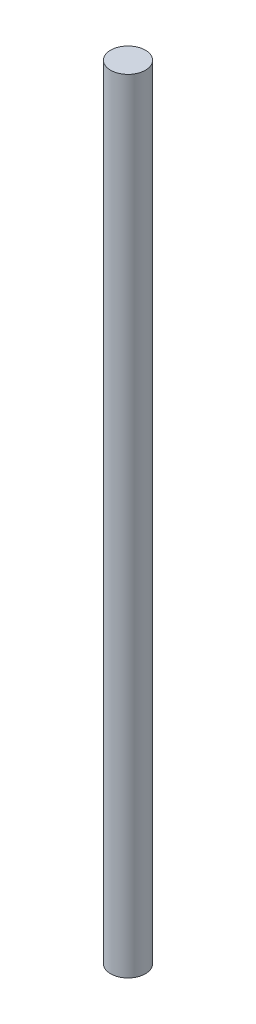
ISO-10303-21;
HEADER;
FILE_DESCRIPTION(('STEP AP214'),'2;1');
FILE_NAME('part.step','',(''),(''),'','','');
FILE_SCHEMA(('AUTOMOTIVE_DESIGN { 1 0 10303 214 1 1 1 1 }'));
ENDSEC;
DATA;
#1=APPLICATION_CONTEXT('core data for automotive mechanical design processes');
#2=APPLICATION_PROTOCOL_DEFINITION('international standard','automotive_design',2000,#1);
#3=PRODUCT_CONTEXT('',#1,'mechanical');
#4=PRODUCT('Part','Part','',(#3));
#5=PRODUCT_RELATED_PRODUCT_CATEGORY('part','',(#4));
#6=PRODUCT_DEFINITION_FORMATION('','',#4);
#7=PRODUCT_DEFINITION_CONTEXT('part definition',#1,'design');
#8=PRODUCT_DEFINITION('design','',#6,#7);
#9=PRODUCT_DEFINITION_SHAPE('','',#8);
#10=(LENGTH_UNIT() NAMED_UNIT(*) SI_UNIT(.MILLI.,.METRE.));
#11=(NAMED_UNIT(*) PLANE_ANGLE_UNIT() SI_UNIT($,.RADIAN.));
#12=(NAMED_UNIT(*) SI_UNIT($,.STERADIAN.) SOLID_ANGLE_UNIT());
#13=UNCERTAINTY_MEASURE_WITH_UNIT(LENGTH_MEASURE(1.E-05),#10,'distance_accuracy_value','');
#14=(GEOMETRIC_REPRESENTATION_CONTEXT(3) GLOBAL_UNCERTAINTY_ASSIGNED_CONTEXT((#13)) GLOBAL_UNIT_ASSIGNED_CONTEXT((#10,
#11,#12)) REPRESENTATION_CONTEXT('',''));
#15=CARTESIAN_POINT('',(0.,0.,0.));
#16=DIRECTION('',(0.,0.,1.));
#17=DIRECTION('',(1.,0.,0.));
#18=AXIS2_PLACEMENT_3D('',#15,#16,#17);
#19=CARTESIAN_POINT('',(0.,45.,0.));
#20=DIRECTION('',(0.,-1.,0.));
#21=DIRECTION('',(0.,0.,-1.));
#22=AXIS2_PLACEMENT_3D('',#19,#20,#21);
#23=CYLINDRICAL_SURFACE('',#22,2.);
#24=CARTESIAN_POINT('',(0.,45.,0.));
#25=DIRECTION('',(0.,1.,0.));
#26=DIRECTION('',(0.,0.,1.));
#27=AXIS2_PLACEMENT_3D('',#24,#25,#26);
#28=CIRCLE('',#27,2.);
#29=CARTESIAN_POINT('',(0.,45.,-2.));
#30=VERTEX_POINT('',#29);
#31=EDGE_CURVE('E10',#30,#30,#28,.T.);
#32=CARTESIAN_POINT('',(0.,-45.,0.));
#33=DIRECTION('',(0.,1.,0.));
#34=DIRECTION('',(0.,0.,1.));
#35=AXIS2_PLACEMENT_3D('',#32,#33,#34);
#36=CIRCLE('',#35,2.);
#37=CARTESIAN_POINT('',(0.,-45.,-2.));
#38=VERTEX_POINT('',#37);
#39=EDGE_CURVE('E40',#38,#38,#36,.T.);
#40=CARTESIAN_POINT('',(0.,45.,-2.));
#41=CARTESIAN_POINT('',(0.,44.0625,-2.));
#42=CARTESIAN_POINT('',(0.,43.125,-2.));
#43=CARTESIAN_POINT('',(0.,41.25,-2.));
#44=CARTESIAN_POINT('',(0.,40.3125,-2.));
#45=CARTESIAN_POINT('',(0.,38.4375,-2.));
#46=CARTESIAN_POINT('',(0.,37.5,-2.));
#47=CARTESIAN_POINT('',(0.,35.625,-2.));
#48=CARTESIAN_POINT('',(0.,34.6875,-2.));
#49=CARTESIAN_POINT('',(0.,32.8125,-2.));
#50=CARTESIAN_POINT('',(0.,31.875,-2.));
#51=CARTESIAN_POINT('',(0.,30.,-2.));
#52=CARTESIAN_POINT('',(0.,29.0625,-2.));
#53=CARTESIAN_POINT('',(0.,27.1875,-2.));
#54=CARTESIAN_POINT('',(0.,26.25,-2.));
#55=CARTESIAN_POINT('',(0.,24.375,-2.));
#56=CARTESIAN_POINT('',(0.,23.4375,-2.));
#57=CARTESIAN_POINT('',(0.,21.5625,-2.));
#58=CARTESIAN_POINT('',(0.,20.625,-2.));
#59=CARTESIAN_POINT('',(0.,18.75,-2.));
#60=CARTESIAN_POINT('',(0.,17.8125,-2.));
#61=CARTESIAN_POINT('',(0.,15.9375,-2.));
#62=CARTESIAN_POINT('',(0.,15.,-2.));
#63=CARTESIAN_POINT('',(0.,13.125,-2.));
#64=CARTESIAN_POINT('',(0.,12.1875,-2.));
#65=CARTESIAN_POINT('',(0.,10.3125,-2.));
#66=CARTESIAN_POINT('',(0.,9.37499999999999,-2.));
#67=CARTESIAN_POINT('',(0.,7.49999999999999,-2.));
#68=CARTESIAN_POINT('',(0.,6.56249999999999,-2.));
#69=CARTESIAN_POINT('',(0.,4.68749999999999,-2.));
#70=CARTESIAN_POINT('',(0.,3.74999999999999,-2.));
#71=CARTESIAN_POINT('',(0.,1.87499999999999,-2.));
#72=CARTESIAN_POINT('',(0.,0.937499999999987,-2.));
#73=CARTESIAN_POINT('',(0.,-0.937500000000015,-2.));
#74=CARTESIAN_POINT('',(0.,-1.87500000000002,-2.));
#75=CARTESIAN_POINT('',(0.,-3.75000000000002,-2.));
#76=CARTESIAN_POINT('',(0.,-4.68750000000002,-2.));
#77=CARTESIAN_POINT('',(0.,-6.56250000000002,-2.));
#78=CARTESIAN_POINT('',(0.,-7.50000000000002,-2.));
#79=CARTESIAN_POINT('',(0.,-9.37500000000002,-2.));
#80=CARTESIAN_POINT('',(0.,-10.3125,-2.));
#81=CARTESIAN_POINT('',(0.,-12.1875,-2.));
#82=CARTESIAN_POINT('',(0.,-13.125,-2.));
#83=CARTESIAN_POINT('',(0.,-15.,-2.));
#84=CARTESIAN_POINT('',(0.,-15.9375,-2.));
#85=CARTESIAN_POINT('',(0.,-17.8125,-2.));
#86=CARTESIAN_POINT('',(0.,-18.75,-2.));
#87=CARTESIAN_POINT('',(0.,-20.625,-2.));
#88=CARTESIAN_POINT('',(0.,-21.5625,-2.));
#89=CARTESIAN_POINT('',(0.,-23.4375,-2.));
#90=CARTESIAN_POINT('',(0.,-24.375,-2.));
#91=CARTESIAN_POINT('',(0.,-26.25,-2.));
#92=CARTESIAN_POINT('',(0.,-27.1875,-2.));
#93=CARTESIAN_POINT('',(0.,-29.0625,-2.));
#94=CARTESIAN_POINT('',(0.,-30.,-2.));
#95=CARTESIAN_POINT('',(0.,-31.875,-2.));
#96=CARTESIAN_POINT('',(0.,-32.8125,-2.));
#97=CARTESIAN_POINT('',(0.,-34.6875,-2.));
#98=CARTESIAN_POINT('',(0.,-35.625,-2.));
#99=CARTESIAN_POINT('',(0.,-37.5,-2.));
#100=CARTESIAN_POINT('',(0.,-38.4375,-2.));
#101=CARTESIAN_POINT('',(0.,-40.3125,-2.));
#102=CARTESIAN_POINT('',(0.,-41.25,-2.));
#103=CARTESIAN_POINT('',(0.,-43.125,-2.));
#104=CARTESIAN_POINT('',(0.,-44.0625,-2.));
#105=CARTESIAN_POINT('',(0.,-45.,-2.));
#106=B_SPLINE_CURVE_WITH_KNOTS('',3,(#40,#41,#42,#43,#44,#45,#46,#47,#48,#49,#50,#51,#52,#53,
#54,#55,#56,#57,#58,#59,#60,#61,#62,#63,#64,#65,#66,#67,#68,#69,#70,#71,#72,#73,#74,#75,#76,#77,
#78,#79,#80,#81,#82,#83,#84,#85,#86,#87,#88,#89,#90,#91,#92,#93,#94,#95,#96,#97,#98,#99,#100,
#101,#102,#103,#104,#105),.UNSPECIFIED.,.F.,.F.,(4,2,2,2,2,2,2,2,2,2,2,2,2,2,2,2,2,2,2,2,2,2,2,
2,2,2,2,2,2,2,2,2,4),(0.,2.8125,5.625,8.43749999999999,11.25,14.0625,16.875,19.6875,22.5,
25.3125,28.125,30.9375,33.75,36.5625,39.375,42.1875,45.,47.8125,50.625,53.4375,56.25,59.0625,
61.875,64.6875,67.5,70.3125,73.125,75.9375,78.75,81.5625,84.375,87.1875,90.),.UNSPECIFIED.);
#107=EDGE_CURVE('BSEAM37',#30,#38,#106,.T.);
#108=ORIENTED_EDGE('',*,*,#31,.F.);
#109=ORIENTED_EDGE('',*,*,#39,.T.);
#110=ORIENTED_EDGE('',*,*,#107,.T.);
#111=ORIENTED_EDGE('',*,*,#107,.F.);
#112=EDGE_LOOP('',(#108,#110,#109,#111));
#113=FACE_BOUND('',#112,.T.);
#114=ADVANCED_FACE('F37',(#113),#23,.T.);
#115=CARTESIAN_POINT('',(0.,45.,0.));
#116=DIRECTION('',(0.,1.,0.));
#117=DIRECTION('',(0.,0.,1.));
#118=AXIS2_PLACEMENT_3D('',#115,#116,#117);
#119=PLANE('',#118);
#120=ORIENTED_EDGE('',*,*,#31,.T.);
#121=EDGE_LOOP('',(#120));
#122=FACE_BOUND('',#121,.T.);
#123=ADVANCED_FACE('F54',(#122),#119,.T.);
#124=CARTESIAN_POINT('',(0.,-45.,0.));
#125=DIRECTION('',(0.,1.,0.));
#126=DIRECTION('',(0.,0.,1.));
#127=AXIS2_PLACEMENT_3D('',#124,#125,#126);
#128=PLANE('',#127);
#129=ORIENTED_EDGE('',*,*,#39,.F.);
#130=EDGE_LOOP('',(#129));
#131=FACE_BOUND('',#130,.T.);
#132=ADVANCED_FACE('F52',(#131),#128,.F.);
#133=CLOSED_SHELL('',(#114,#123,#132));
#134=MANIFOLD_SOLID_BREP('B2',#133);
#135=ADVANCED_BREP_SHAPE_REPRESENTATION('',(#18,#134),#14);
#136=SHAPE_DEFINITION_REPRESENTATION(#9,#135);
ENDSEC;
END-ISO-10303-21;
